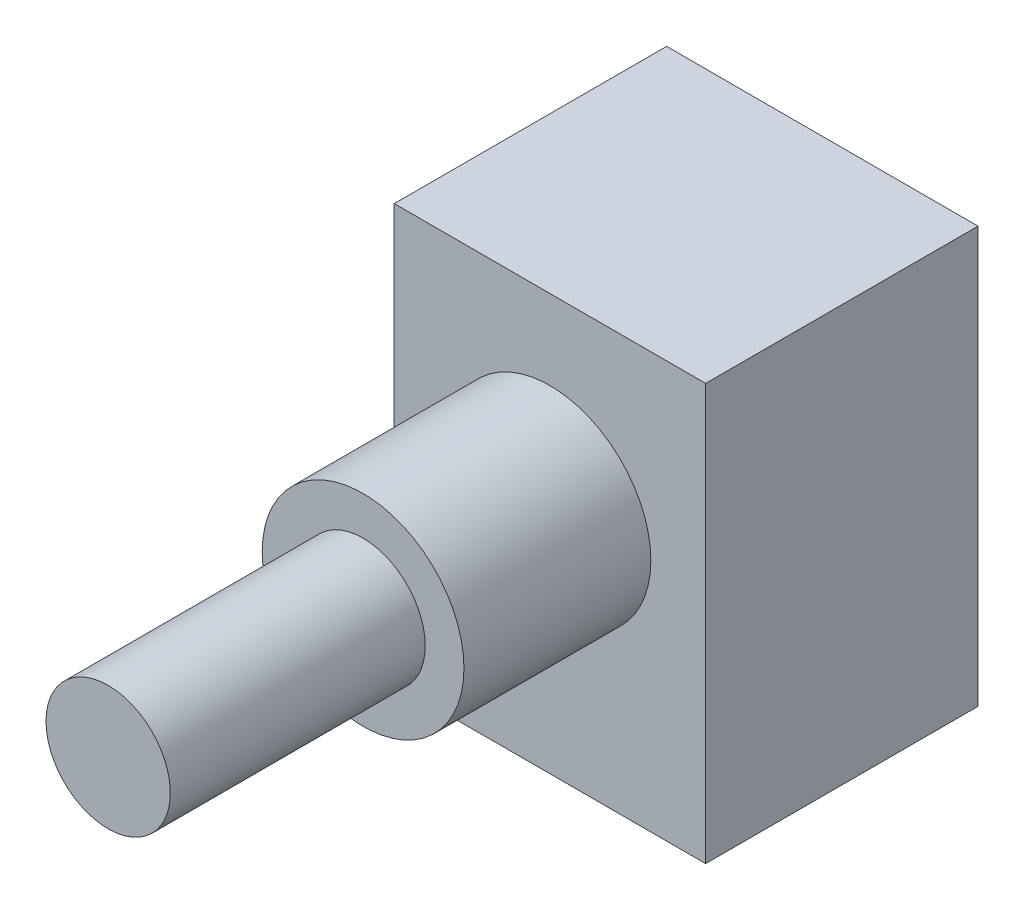
ISO-10303-21;
HEADER;
FILE_DESCRIPTION(('STEP AP214'),'2;1');
FILE_NAME('part.step','',(''),(''),'','','');
FILE_SCHEMA(('AUTOMOTIVE_DESIGN { 1 0 10303 214 1 1 1 1 }'));
ENDSEC;
DATA;
#1=APPLICATION_CONTEXT('core data for automotive mechanical design processes');
#2=APPLICATION_PROTOCOL_DEFINITION('international standard','automotive_design',2000,#1);
#3=PRODUCT_CONTEXT('',#1,'mechanical');
#4=PRODUCT('Part','Part','',(#3));
#5=PRODUCT_RELATED_PRODUCT_CATEGORY('part','',(#4));
#6=PRODUCT_DEFINITION_FORMATION('','',#4);
#7=PRODUCT_DEFINITION_CONTEXT('part definition',#1,'design');
#8=PRODUCT_DEFINITION('design','',#6,#7);
#9=PRODUCT_DEFINITION_SHAPE('','',#8);
#10=(LENGTH_UNIT() NAMED_UNIT(*) SI_UNIT(.MILLI.,.METRE.));
#11=(NAMED_UNIT(*) PLANE_ANGLE_UNIT() SI_UNIT($,.RADIAN.));
#12=(NAMED_UNIT(*) SI_UNIT($,.STERADIAN.) SOLID_ANGLE_UNIT());
#13=UNCERTAINTY_MEASURE_WITH_UNIT(LENGTH_MEASURE(1.E-05),#10,'distance_accuracy_value','');
#14=(GEOMETRIC_REPRESENTATION_CONTEXT(3) GLOBAL_UNCERTAINTY_ASSIGNED_CONTEXT((#13)) GLOBAL_UNIT_ASSIGNED_CONTEXT((#10,
#11,#12)) REPRESENTATION_CONTEXT('',''));
#15=CARTESIAN_POINT('',(0.,0.,0.));
#16=DIRECTION('',(0.,0.,1.));
#17=DIRECTION('',(1.,0.,0.));
#18=AXIS2_PLACEMENT_3D('',#15,#16,#17);
#19=CARTESIAN_POINT('',(0.,0.,13.89));
#20=DIRECTION('',(1.,0.,0.));
#21=DIRECTION('',(0.,0.,-1.));
#22=AXIS2_PLACEMENT_3D('',#19,#20,#21);
#23=PLANE('',#22);
#24=DIRECTION('',(0.,-1.,0.));
#25=VECTOR('',#24,1.);
#26=CARTESIAN_POINT('',(0.,0.,0.));
#27=LINE('',#26,#25);
#28=CARTESIAN_POINT('',(0.,21.21,0.));
#29=VERTEX_POINT('',#28);
#30=CARTESIAN_POINT('',(0.,0.,0.));
#31=VERTEX_POINT('',#30);
#32=EDGE_CURVE('E104',#29,#31,#27,.T.);
#33=ORIENTED_EDGE('',*,*,#32,.T.);
#34=DIRECTION('',(0.,0.,-1.));
#35=VECTOR('',#34,1.);
#36=CARTESIAN_POINT('',(0.,0.,13.89));
#37=LINE('',#36,#35);
#38=CARTESIAN_POINT('',(0.,0.,13.89));
#39=VERTEX_POINT('',#38);
#40=EDGE_CURVE('E40',#39,#31,#37,.T.);
#41=ORIENTED_EDGE('',*,*,#40,.F.);
#42=DIRECTION('',(0.,-1.,0.));
#43=VECTOR('',#42,1.);
#44=CARTESIAN_POINT('',(0.,0.,13.89));
#45=LINE('',#44,#43);
#46=CARTESIAN_POINT('',(0.,21.21,13.89));
#47=VERTEX_POINT('',#46);
#48=EDGE_CURVE('E91',#47,#39,#45,.T.);
#49=ORIENTED_EDGE('',*,*,#48,.F.);
#50=DIRECTION('',(0.,0.,-1.));
#51=VECTOR('',#50,1.);
#52=CARTESIAN_POINT('',(0.,21.21,13.89));
#53=LINE('',#52,#51);
#54=EDGE_CURVE('E100',#47,#29,#53,.T.);
#55=ORIENTED_EDGE('',*,*,#54,.T.);
#56=EDGE_LOOP('',(#33,#41,#49,#55));
#57=FACE_BOUND('',#56,.T.);
#58=ADVANCED_FACE('F37',(#57),#23,.F.);
#59=CARTESIAN_POINT('',(0.,0.,13.89));
#60=DIRECTION('',(0.,1.,0.));
#61=DIRECTION('',(0.,0.,1.));
#62=AXIS2_PLACEMENT_3D('',#59,#60,#61);
#63=PLANE('',#62);
#64=DIRECTION('',(1.,0.,0.));
#65=VECTOR('',#64,1.);
#66=CARTESIAN_POINT('',(0.,0.,0.));
#67=LINE('',#66,#65);
#68=CARTESIAN_POINT('',(15.88,0.,0.));
#69=VERTEX_POINT('',#68);
#70=EDGE_CURVE('E96',#31,#69,#67,.T.);
#71=ORIENTED_EDGE('',*,*,#70,.T.);
#72=DIRECTION('',(0.,0.,-1.));
#73=VECTOR('',#72,1.);
#74=CARTESIAN_POINT('',(15.88,0.,13.89));
#75=LINE('',#74,#73);
#76=CARTESIAN_POINT('',(15.88,0.,13.89));
#77=VERTEX_POINT('',#76);
#78=EDGE_CURVE('E94',#77,#69,#75,.T.);
#79=ORIENTED_EDGE('',*,*,#78,.F.);
#80=DIRECTION('',(1.,0.,0.));
#81=VECTOR('',#80,1.);
#82=CARTESIAN_POINT('',(0.,0.,13.89));
#83=LINE('',#82,#81);
#84=EDGE_CURVE('E86',#39,#77,#83,.T.);
#85=ORIENTED_EDGE('',*,*,#84,.F.);
#86=ORIENTED_EDGE('',*,*,#40,.T.);
#87=EDGE_LOOP('',(#71,#79,#85,#86));
#88=FACE_BOUND('',#87,.T.);
#89=ADVANCED_FACE('F95',(#88),#63,.F.);
#90=CARTESIAN_POINT('',(15.88,0.,13.89));
#91=DIRECTION('',(-1.,0.,0.));
#92=DIRECTION('',(0.,0.,1.));
#93=AXIS2_PLACEMENT_3D('',#90,#91,#92);
#94=PLANE('',#93);
#95=DIRECTION('',(0.,1.,0.));
#96=VECTOR('',#95,1.);
#97=CARTESIAN_POINT('',(15.88,0.,0.));
#98=LINE('',#97,#96);
#99=CARTESIAN_POINT('',(15.88,21.21,0.));
#100=VERTEX_POINT('',#99);
#101=EDGE_CURVE('E72',#69,#100,#98,.T.);
#102=ORIENTED_EDGE('',*,*,#101,.T.);
#103=DIRECTION('',(0.,0.,-1.));
#104=VECTOR('',#103,1.);
#105=CARTESIAN_POINT('',(15.88,21.21,13.89));
#106=LINE('',#105,#104);
#107=CARTESIAN_POINT('',(15.88,21.21,13.89));
#108=VERTEX_POINT('',#107);
#109=EDGE_CURVE('E97',#108,#100,#106,.T.);
#110=ORIENTED_EDGE('',*,*,#109,.F.);
#111=DIRECTION('',(0.,1.,0.));
#112=VECTOR('',#111,1.);
#113=CARTESIAN_POINT('',(15.88,0.,13.89));
#114=LINE('',#113,#112);
#115=EDGE_CURVE('E89',#77,#108,#114,.T.);
#116=ORIENTED_EDGE('',*,*,#115,.F.);
#117=ORIENTED_EDGE('',*,*,#78,.T.);
#118=EDGE_LOOP('',(#102,#110,#116,#117));
#119=FACE_BOUND('',#118,.T.);
#120=ADVANCED_FACE('F98',(#119),#94,.F.);
#121=CARTESIAN_POINT('',(0.,21.21,13.89));
#122=DIRECTION('',(0.,-1.,0.));
#123=DIRECTION('',(0.,0.,-1.));
#124=AXIS2_PLACEMENT_3D('',#121,#122,#123);
#125=PLANE('',#124);
#126=DIRECTION('',(-1.,0.,0.));
#127=VECTOR('',#126,1.);
#128=CARTESIAN_POINT('',(0.,21.21,0.));
#129=LINE('',#128,#127);
#130=EDGE_CURVE('E78',#100,#29,#129,.T.);
#131=ORIENTED_EDGE('',*,*,#130,.T.);
#132=ORIENTED_EDGE('',*,*,#54,.F.);
#133=DIRECTION('',(-1.,0.,0.));
#134=VECTOR('',#133,1.);
#135=CARTESIAN_POINT('',(0.,21.21,13.89));
#136=LINE('',#135,#134);
#137=EDGE_CURVE('E55',#108,#47,#136,.T.);
#138=ORIENTED_EDGE('',*,*,#137,.F.);
#139=ORIENTED_EDGE('',*,*,#109,.T.);
#140=EDGE_LOOP('',(#131,#132,#138,#139));
#141=FACE_BOUND('',#140,.T.);
#142=ADVANCED_FACE('F112',(#141),#125,.F.);
#143=CARTESIAN_POINT('',(0.,0.,13.89));
#144=DIRECTION('',(0.,0.,-1.));
#145=DIRECTION('',(-1.,0.,0.));
#146=AXIS2_PLACEMENT_3D('',#143,#144,#145);
#147=PLANE('',#146);
#148=CARTESIAN_POINT('',(7.94,12.,13.89));
#149=DIRECTION('',(0.,0.,1.));
#150=DIRECTION('',(1.,0.,0.));
#151=AXIS2_PLACEMENT_3D('',#148,#149,#150);
#152=CIRCLE('',#151,5.145);
#153=CARTESIAN_POINT('',(13.085,12.,13.89));
#154=VERTEX_POINT('',#153);
#155=EDGE_CURVE('E46',#154,#154,#152,.T.);
#156=ORIENTED_EDGE('',*,*,#155,.F.);
#157=EDGE_LOOP('',(#156));
#158=FACE_BOUND('',#157,.T.);
#159=ORIENTED_EDGE('',*,*,#48,.T.);
#160=ORIENTED_EDGE('',*,*,#84,.T.);
#161=ORIENTED_EDGE('',*,*,#115,.T.);
#162=ORIENTED_EDGE('',*,*,#137,.T.);
#163=EDGE_LOOP('',(#159,#160,#161,#162));
#164=FACE_BOUND('',#163,.T.);
#165=ADVANCED_FACE('F87',(#158,#164),#147,.F.);
#166=CARTESIAN_POINT('',(0.,0.,0.));
#167=DIRECTION('',(0.,0.,-1.));
#168=DIRECTION('',(-1.,0.,0.));
#169=AXIS2_PLACEMENT_3D('',#166,#167,#168);
#170=PLANE('',#169);
#171=ORIENTED_EDGE('',*,*,#32,.F.);
#172=ORIENTED_EDGE('',*,*,#130,.F.);
#173=ORIENTED_EDGE('',*,*,#101,.F.);
#174=ORIENTED_EDGE('',*,*,#70,.F.);
#175=EDGE_LOOP('',(#171,#172,#173,#174));
#176=FACE_BOUND('',#175,.T.);
#177=ADVANCED_FACE('F115',(#176),#170,.T.);
#178=CARTESIAN_POINT('',(7.94,12.,23.42));
#179=DIRECTION('',(0.,0.,-1.));
#180=DIRECTION('',(-1.,0.,0.));
#181=AXIS2_PLACEMENT_3D('',#178,#179,#180);
#182=CYLINDRICAL_SURFACE('',#181,5.145);
#183=CARTESIAN_POINT('',(7.94,12.,23.42));
#184=DIRECTION('',(0.,0.,1.));
#185=DIRECTION('',(1.,0.,0.));
#186=AXIS2_PLACEMENT_3D('',#183,#184,#185);
#187=CIRCLE('',#186,5.145);
#188=CARTESIAN_POINT('',(13.085,12.,23.42));
#189=VERTEX_POINT('',#188);
#190=EDGE_CURVE('E107',#189,#189,#187,.T.);
#191=ORIENTED_EDGE('',*,*,#190,.F.);
#192=EDGE_LOOP('',(#191));
#193=FACE_BOUND('',#192,.T.);
#194=ORIENTED_EDGE('',*,*,#155,.T.);
#195=EDGE_LOOP('',(#194));
#196=FACE_BOUND('',#195,.T.);
#197=ADVANCED_FACE('F150',(#193,#196),#182,.T.);
#198=CARTESIAN_POINT('',(7.94,12.,23.42));
#199=DIRECTION('',(0.,0.,1.));
#200=DIRECTION('',(1.,0.,0.));
#201=AXIS2_PLACEMENT_3D('',#198,#199,#200);
#202=PLANE('',#201);
#203=CARTESIAN_POINT('',(7.94,12.,23.42));
#204=DIRECTION('',(0.,0.,1.));
#205=DIRECTION('',(1.,0.,0.));
#206=AXIS2_PLACEMENT_3D('',#203,#204,#205);
#207=CIRCLE('',#206,3.17);
#208=CARTESIAN_POINT('',(11.11,12.,23.42));
#209=VERTEX_POINT('',#208);
#210=EDGE_CURVE('E12',#209,#209,#207,.T.);
#211=ORIENTED_EDGE('',*,*,#210,.F.);
#212=EDGE_LOOP('',(#211));
#213=FACE_BOUND('',#212,.T.);
#214=ORIENTED_EDGE('',*,*,#190,.T.);
#215=EDGE_LOOP('',(#214));
#216=FACE_BOUND('',#215,.T.);
#217=ADVANCED_FACE('F135',(#213,#216),#202,.T.);
#218=CARTESIAN_POINT('',(7.94,12.,67.9161139854454));
#219=DIRECTION('',(0.,0.,-1.));
#220=DIRECTION('',(-1.,0.,0.));
#221=AXIS2_PLACEMENT_3D('',#218,#219,#220);
#222=CYLINDRICAL_SURFACE('',#221,3.17);
#223=CARTESIAN_POINT('',(7.94,12.,36.42));
#224=DIRECTION('',(0.,0.,-1.));
#225=DIRECTION('',(-1.,0.,0.));
#226=AXIS2_PLACEMENT_3D('',#223,#224,#225);
#227=CIRCLE('',#226,3.17);
#228=CARTESIAN_POINT('',(4.77,12.,36.42));
#229=VERTEX_POINT('',#228);
#230=EDGE_CURVE('E122',#229,#229,#227,.T.);
#231=ORIENTED_EDGE('',*,*,#230,.T.);
#232=EDGE_LOOP('',(#231));
#233=FACE_BOUND('',#232,.T.);
#234=ORIENTED_EDGE('',*,*,#210,.T.);
#235=EDGE_LOOP('',(#234));
#236=FACE_BOUND('',#235,.T.);
#237=ADVANCED_FACE('F126',(#233,#236),#222,.T.);
#238=CARTESIAN_POINT('',(0.,0.,36.42));
#239=DIRECTION('',(0.,0.,-1.));
#240=DIRECTION('',(-1.,0.,0.));
#241=AXIS2_PLACEMENT_3D('',#238,#239,#240);
#242=PLANE('',#241);
#243=ORIENTED_EDGE('',*,*,#230,.F.);
#244=EDGE_LOOP('',(#243));
#245=FACE_BOUND('',#244,.T.);
#246=ADVANCED_FACE('F129',(#245),#242,.F.);
#247=CLOSED_SHELL('',(#58,#89,#120,#142,#165,#177,#197,#217,#237,#246));
#248=MANIFOLD_SOLID_BREP('B2',#247);
#249=ADVANCED_BREP_SHAPE_REPRESENTATION('',(#18,#248),#14);
#250=SHAPE_DEFINITION_REPRESENTATION(#9,#249);
ENDSEC;
END-ISO-10303-21;
